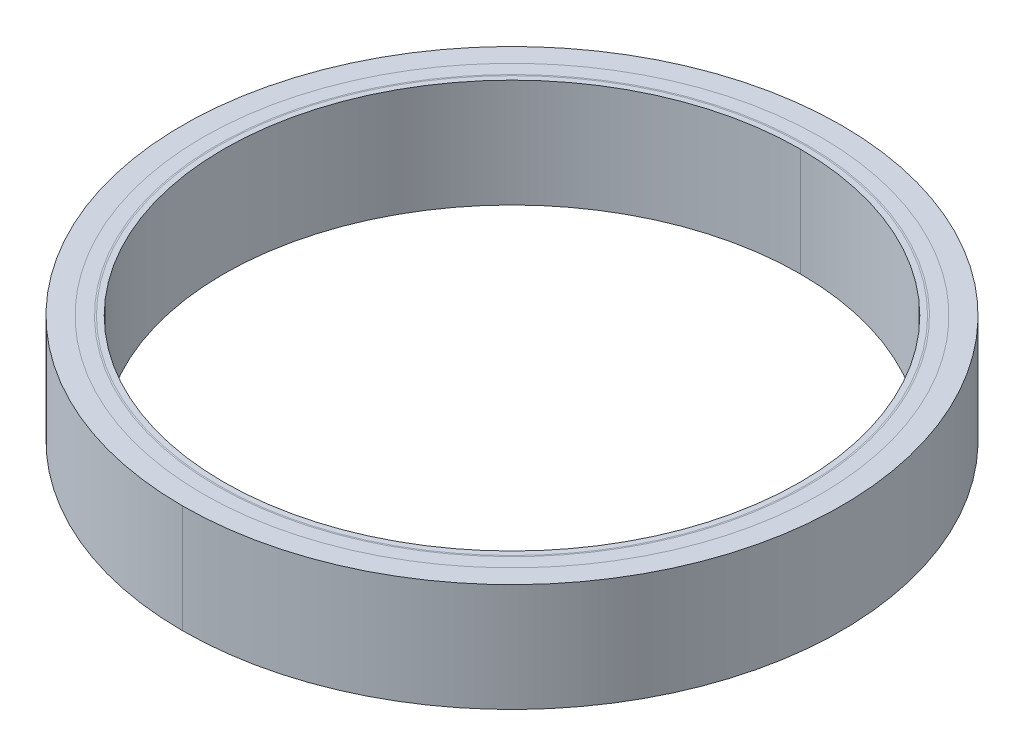
ISO-10303-21;
HEADER;
FILE_DESCRIPTION(('STEP AP214'),'2;1');
FILE_NAME('part.step','',(''),(''),'','','');
FILE_SCHEMA(('AUTOMOTIVE_DESIGN { 1 0 10303 214 1 1 1 1 }'));
ENDSEC;
DATA;
#1=APPLICATION_CONTEXT('core data for automotive mechanical design processes');
#2=APPLICATION_PROTOCOL_DEFINITION('international standard','automotive_design',2000,#1);
#3=PRODUCT_CONTEXT('',#1,'mechanical');
#4=PRODUCT('Part','Part','',(#3));
#5=PRODUCT_RELATED_PRODUCT_CATEGORY('part','',(#4));
#6=PRODUCT_DEFINITION_FORMATION('','',#4);
#7=PRODUCT_DEFINITION_CONTEXT('part definition',#1,'design');
#8=PRODUCT_DEFINITION('design','',#6,#7);
#9=PRODUCT_DEFINITION_SHAPE('','',#8);
#10=(LENGTH_UNIT() NAMED_UNIT(*) SI_UNIT(.MILLI.,.METRE.));
#11=(NAMED_UNIT(*) PLANE_ANGLE_UNIT() SI_UNIT($,.RADIAN.));
#12=(NAMED_UNIT(*) SI_UNIT($,.STERADIAN.) SOLID_ANGLE_UNIT());
#13=UNCERTAINTY_MEASURE_WITH_UNIT(LENGTH_MEASURE(1.E-05),#10,'distance_accuracy_value','');
#14=(GEOMETRIC_REPRESENTATION_CONTEXT(3) GLOBAL_UNCERTAINTY_ASSIGNED_CONTEXT((#13)) GLOBAL_UNIT_ASSIGNED_CONTEXT((#10,
#11,#12)) REPRESENTATION_CONTEXT('',''));
#15=CARTESIAN_POINT('',(0.,0.,0.));
#16=DIRECTION('',(0.,0.,1.));
#17=DIRECTION('',(1.,0.,0.));
#18=AXIS2_PLACEMENT_3D('',#15,#16,#17);
#19=CARTESIAN_POINT('',(0.,914.4,0.));
#20=DIRECTION('',(0.,1.,0.));
#21=DIRECTION('',(0.,0.,-1.));
#22=AXIS2_PLACEMENT_3D('',#19,#20,#21);
#23=CYLINDRICAL_SURFACE('',#22,133.35);
#24=DIRECTION('',(0.,1.,0.));
#25=VECTOR('',#24,1.);
#26=CARTESIAN_POINT('',(0.,914.4,-133.35));
#27=LINE('',#26,#25);
#28=CARTESIAN_POINT('',(0.,914.4,-133.35));
#29=VERTEX_POINT('',#28);
#30=CARTESIAN_POINT('',(0.,964.4,-133.35));
#31=VERTEX_POINT('',#30);
#32=EDGE_CURVE('E112',#29,#31,#27,.T.);
#33=ORIENTED_EDGE('',*,*,#32,.T.);
#34=CARTESIAN_POINT('',(0.,964.4,0.));
#35=DIRECTION('',(0.,-1.,0.));
#36=DIRECTION('',(0.,0.,-1.));
#37=AXIS2_PLACEMENT_3D('',#34,#35,#36);
#38=CIRCLE('',#37,133.35);
#39=CARTESIAN_POINT('',(0.,964.4,133.35));
#40=VERTEX_POINT('',#39);
#41=EDGE_CURVE('E87',#31,#40,#38,.F.);
#42=ORIENTED_EDGE('',*,*,#41,.T.);
#43=DIRECTION('',(0.,-1.,0.));
#44=VECTOR('',#43,1.);
#45=CARTESIAN_POINT('',(0.,914.4,133.35));
#46=LINE('',#45,#44);
#47=CARTESIAN_POINT('',(0.,914.4,133.35));
#48=VERTEX_POINT('',#47);
#49=EDGE_CURVE('E110',#40,#48,#46,.T.);
#50=ORIENTED_EDGE('',*,*,#49,.T.);
#51=CARTESIAN_POINT('',(0.,914.4,0.));
#52=DIRECTION('',(0.,-1.,0.));
#53=DIRECTION('',(0.,0.,-1.));
#54=AXIS2_PLACEMENT_3D('',#51,#52,#53);
#55=CIRCLE('',#54,133.35);
#56=EDGE_CURVE('E133',#29,#48,#55,.F.);
#57=ORIENTED_EDGE('',*,*,#56,.F.);
#58=EDGE_LOOP('',(#33,#42,#50,#57));
#59=FACE_BOUND('',#58,.T.);
#60=ADVANCED_FACE('F67',(#59),#23,.F.);
#61=CARTESIAN_POINT('',(0.,914.4,0.));
#62=DIRECTION('',(0.,1.,0.));
#63=DIRECTION('',(0.,0.,-1.));
#64=AXIS2_PLACEMENT_3D('',#61,#62,#63);
#65=CYLINDRICAL_SURFACE('',#64,135.89);
#66=CARTESIAN_POINT('',(0.,964.4,0.));
#67=DIRECTION('',(0.,-1.,0.));
#68=DIRECTION('',(0.,0.,-1.));
#69=AXIS2_PLACEMENT_3D('',#66,#67,#68);
#70=CIRCLE('',#69,135.89);
#71=CARTESIAN_POINT('',(0.,964.4,-135.89));
#72=VERTEX_POINT('',#71);
#73=CARTESIAN_POINT('',(0.,964.4,135.89));
#74=VERTEX_POINT('',#73);
#75=EDGE_CURVE('E80',#72,#74,#70,.F.);
#76=ORIENTED_EDGE('',*,*,#75,.F.);
#77=DIRECTION('',(0.,-1.,0.));
#78=VECTOR('',#77,1.);
#79=CARTESIAN_POINT('',(0.,914.4,-135.89));
#80=LINE('',#79,#78);
#81=CARTESIAN_POINT('',(0.,914.4,-135.89));
#82=VERTEX_POINT('',#81);
#83=EDGE_CURVE('E118',#72,#82,#80,.T.);
#84=ORIENTED_EDGE('',*,*,#83,.T.);
#85=CARTESIAN_POINT('',(0.,914.4,0.));
#86=DIRECTION('',(0.,-1.,0.));
#87=DIRECTION('',(0.,0.,-1.));
#88=AXIS2_PLACEMENT_3D('',#85,#86,#87);
#89=CIRCLE('',#88,135.89);
#90=CARTESIAN_POINT('',(0.,914.4,135.89));
#91=VERTEX_POINT('',#90);
#92=EDGE_CURVE('E126',#82,#91,#89,.F.);
#93=ORIENTED_EDGE('',*,*,#92,.T.);
#94=DIRECTION('',(0.,1.,0.));
#95=VECTOR('',#94,1.);
#96=CARTESIAN_POINT('',(0.,914.4,135.89));
#97=LINE('',#96,#95);
#98=EDGE_CURVE('E123',#91,#74,#97,.T.);
#99=ORIENTED_EDGE('',*,*,#98,.T.);
#100=EDGE_LOOP('',(#76,#84,#93,#99));
#101=FACE_BOUND('',#100,.T.);
#102=ADVANCED_FACE('F145',(#101),#65,.T.);
#103=CARTESIAN_POINT('',(0.,914.4,0.));
#104=DIRECTION('',(0.,1.,0.));
#105=DIRECTION('',(0.,0.,-1.));
#106=AXIS2_PLACEMENT_3D('',#103,#104,#105);
#107=CYLINDRICAL_SURFACE('',#106,135.89);
#108=CARTESIAN_POINT('',(0.,964.4,0.));
#109=DIRECTION('',(0.,-1.,0.));
#110=DIRECTION('',(0.,0.,-1.));
#111=AXIS2_PLACEMENT_3D('',#108,#109,#110);
#112=CIRCLE('',#111,135.89);
#113=EDGE_CURVE('E113',#74,#72,#112,.F.);
#114=ORIENTED_EDGE('',*,*,#113,.F.);
#115=ORIENTED_EDGE('',*,*,#98,.F.);
#116=CARTESIAN_POINT('',(0.,914.4,0.));
#117=DIRECTION('',(0.,-1.,0.));
#118=DIRECTION('',(0.,0.,-1.));
#119=AXIS2_PLACEMENT_3D('',#116,#117,#118);
#120=CIRCLE('',#119,135.89);
#121=EDGE_CURVE('E134',#91,#82,#120,.F.);
#122=ORIENTED_EDGE('',*,*,#121,.T.);
#123=ORIENTED_EDGE('',*,*,#83,.F.);
#124=EDGE_LOOP('',(#114,#115,#122,#123));
#125=FACE_BOUND('',#124,.T.);
#126=ADVANCED_FACE('F149',(#125),#107,.T.);
#127=CARTESIAN_POINT('',(0.,914.4,0.));
#128=DIRECTION('',(0.,1.,0.));
#129=DIRECTION('',(0.,0.,-1.));
#130=AXIS2_PLACEMENT_3D('',#127,#128,#129);
#131=CYLINDRICAL_SURFACE('',#130,133.35);
#132=ORIENTED_EDGE('',*,*,#49,.F.);
#133=CARTESIAN_POINT('',(0.,964.4,0.));
#134=DIRECTION('',(0.,-1.,0.));
#135=DIRECTION('',(0.,0.,-1.));
#136=AXIS2_PLACEMENT_3D('',#133,#134,#135);
#137=CIRCLE('',#136,133.35);
#138=EDGE_CURVE('E12',#40,#31,#137,.F.);
#139=ORIENTED_EDGE('',*,*,#138,.T.);
#140=ORIENTED_EDGE('',*,*,#32,.F.);
#141=CARTESIAN_POINT('',(0.,914.4,0.));
#142=DIRECTION('',(0.,-1.,0.));
#143=DIRECTION('',(0.,0.,-1.));
#144=AXIS2_PLACEMENT_3D('',#141,#142,#143);
#145=CIRCLE('',#144,133.35);
#146=EDGE_CURVE('E74',#48,#29,#145,.F.);
#147=ORIENTED_EDGE('',*,*,#146,.F.);
#148=EDGE_LOOP('',(#132,#139,#140,#147));
#149=FACE_BOUND('',#148,.T.);
#150=ADVANCED_FACE('F116',(#149),#131,.F.);
#151=CARTESIAN_POINT('',(0.,914.4,0.));
#152=DIRECTION('',(0.,-1.,0.));
#153=DIRECTION('',(0.,0.,-1.));
#154=AXIS2_PLACEMENT_3D('',#151,#152,#153);
#155=PLANE('',#154);
#156=ORIENTED_EDGE('',*,*,#121,.F.);
#157=ORIENTED_EDGE('',*,*,#92,.F.);
#158=EDGE_LOOP('',(#156,#157));
#159=FACE_BOUND('',#158,.T.);
#160=ORIENTED_EDGE('',*,*,#56,.T.);
#161=ORIENTED_EDGE('',*,*,#146,.T.);
#162=EDGE_LOOP('',(#160,#161));
#163=FACE_BOUND('',#162,.T.);
#164=ADVANCED_FACE('F132',(#159,#163),#155,.T.);
#165=CARTESIAN_POINT('',(0.,964.4,0.));
#166=DIRECTION('',(0.,-1.,0.));
#167=DIRECTION('',(0.,0.,-1.));
#168=AXIS2_PLACEMENT_3D('',#165,#166,#167);
#169=PLANE('',#168);
#170=ORIENTED_EDGE('',*,*,#75,.T.);
#171=ORIENTED_EDGE('',*,*,#113,.T.);
#172=EDGE_LOOP('',(#170,#171));
#173=FACE_BOUND('',#172,.T.);
#174=ORIENTED_EDGE('',*,*,#138,.F.);
#175=ORIENTED_EDGE('',*,*,#41,.F.);
#176=EDGE_LOOP('',(#174,#175));
#177=FACE_BOUND('',#176,.T.);
#178=ADVANCED_FACE('F103',(#173,#177),#169,.F.);
#179=CLOSED_SHELL('',(#60,#102,#126,#150,#164,#178));
#180=MANIFOLD_SOLID_BREP('B2',#179);
#181=CARTESIAN_POINT('',(0.,914.4,0.));
#182=DIRECTION('',(0.,1.,0.));
#183=DIRECTION('',(0.,0.,-1.));
#184=AXIS2_PLACEMENT_3D('',#181,#182,#183);
#185=CYLINDRICAL_SURFACE('',#184,135.89);
#186=DIRECTION('',(0.,1.,0.));
#187=VECTOR('',#186,1.);
#188=CARTESIAN_POINT('',(0.,914.4,-135.89));
#189=LINE('',#188,#187);
#190=CARTESIAN_POINT('',(0.,914.4,-135.89));
#191=VERTEX_POINT('',#190);
#192=CARTESIAN_POINT('',(0.,964.4,-135.89));
#193=VERTEX_POINT('',#192);
#194=EDGE_CURVE('E287',#191,#193,#189,.T.);
#195=ORIENTED_EDGE('',*,*,#194,.T.);
#196=CARTESIAN_POINT('',(0.,964.4,0.));
#197=DIRECTION('',(0.,-1.,0.));
#198=DIRECTION('',(0.,0.,-1.));
#199=AXIS2_PLACEMENT_3D('',#196,#197,#198);
#200=CIRCLE('',#199,135.89);
#201=CARTESIAN_POINT('',(0.,964.4,135.89));
#202=VERTEX_POINT('',#201);
#203=EDGE_CURVE('E262',#193,#202,#200,.F.);
#204=ORIENTED_EDGE('',*,*,#203,.T.);
#205=DIRECTION('',(0.,-1.,0.));
#206=VECTOR('',#205,1.);
#207=CARTESIAN_POINT('',(0.,914.4,135.89));
#208=LINE('',#207,#206);
#209=CARTESIAN_POINT('',(0.,914.4,135.89));
#210=VERTEX_POINT('',#209);
#211=EDGE_CURVE('E285',#202,#210,#208,.T.);
#212=ORIENTED_EDGE('',*,*,#211,.T.);
#213=CARTESIAN_POINT('',(0.,914.4,0.));
#214=DIRECTION('',(0.,-1.,0.));
#215=DIRECTION('',(0.,0.,-1.));
#216=AXIS2_PLACEMENT_3D('',#213,#214,#215);
#217=CIRCLE('',#216,135.89);
#218=EDGE_CURVE('E309',#191,#210,#217,.F.);
#219=ORIENTED_EDGE('',*,*,#218,.F.);
#220=EDGE_LOOP('',(#195,#204,#212,#219));
#221=FACE_BOUND('',#220,.T.);
#222=ADVANCED_FACE('F242',(#221),#185,.F.);
#223=CARTESIAN_POINT('',(0.,914.4,0.));
#224=DIRECTION('',(0.,1.,0.));
#225=DIRECTION('',(0.,0.,-1.));
#226=AXIS2_PLACEMENT_3D('',#223,#224,#225);
#227=CYLINDRICAL_SURFACE('',#226,136.525);
#228=CARTESIAN_POINT('',(0.,964.4,0.));
#229=DIRECTION('',(0.,-1.,0.));
#230=DIRECTION('',(0.,0.,-1.));
#231=AXIS2_PLACEMENT_3D('',#228,#229,#230);
#232=CIRCLE('',#231,136.525);
#233=CARTESIAN_POINT('',(0.,964.4,-136.525));
#234=VERTEX_POINT('',#233);
#235=CARTESIAN_POINT('',(0.,964.4,136.525));
#236=VERTEX_POINT('',#235);
#237=EDGE_CURVE('E255',#234,#236,#232,.F.);
#238=ORIENTED_EDGE('',*,*,#237,.F.);
#239=DIRECTION('',(0.,-1.,0.));
#240=VECTOR('',#239,1.);
#241=CARTESIAN_POINT('',(0.,914.4,-136.525));
#242=LINE('',#241,#240);
#243=CARTESIAN_POINT('',(0.,914.4,-136.525));
#244=VERTEX_POINT('',#243);
#245=EDGE_CURVE('E293',#234,#244,#242,.T.);
#246=ORIENTED_EDGE('',*,*,#245,.T.);
#247=CARTESIAN_POINT('',(0.,914.4,0.));
#248=DIRECTION('',(0.,-1.,0.));
#249=DIRECTION('',(0.,0.,-1.));
#250=AXIS2_PLACEMENT_3D('',#247,#248,#249);
#251=CIRCLE('',#250,136.525);
#252=CARTESIAN_POINT('',(0.,914.4,136.525));
#253=VERTEX_POINT('',#252);
#254=EDGE_CURVE('E301',#244,#253,#251,.F.);
#255=ORIENTED_EDGE('',*,*,#254,.T.);
#256=DIRECTION('',(0.,1.,0.));
#257=VECTOR('',#256,1.);
#258=CARTESIAN_POINT('',(0.,914.4,136.525));
#259=LINE('',#258,#257);
#260=EDGE_CURVE('E298',#253,#236,#259,.T.);
#261=ORIENTED_EDGE('',*,*,#260,.T.);
#262=EDGE_LOOP('',(#238,#246,#255,#261));
#263=FACE_BOUND('',#262,.T.);
#264=ADVANCED_FACE('F320',(#263),#227,.T.);
#265=CARTESIAN_POINT('',(0.,914.4,0.));
#266=DIRECTION('',(0.,1.,0.));
#267=DIRECTION('',(0.,0.,-1.));
#268=AXIS2_PLACEMENT_3D('',#265,#266,#267);
#269=CYLINDRICAL_SURFACE('',#268,136.525);
#270=CARTESIAN_POINT('',(0.,964.4,0.));
#271=DIRECTION('',(0.,-1.,0.));
#272=DIRECTION('',(0.,0.,-1.));
#273=AXIS2_PLACEMENT_3D('',#270,#271,#272);
#274=CIRCLE('',#273,136.525);
#275=EDGE_CURVE('E288',#236,#234,#274,.F.);
#276=ORIENTED_EDGE('',*,*,#275,.F.);
#277=ORIENTED_EDGE('',*,*,#260,.F.);
#278=CARTESIAN_POINT('',(0.,914.4,0.));
#279=DIRECTION('',(0.,-1.,0.));
#280=DIRECTION('',(0.,0.,-1.));
#281=AXIS2_PLACEMENT_3D('',#278,#279,#280);
#282=CIRCLE('',#281,136.525);
#283=EDGE_CURVE('E310',#253,#244,#282,.F.);
#284=ORIENTED_EDGE('',*,*,#283,.T.);
#285=ORIENTED_EDGE('',*,*,#245,.F.);
#286=EDGE_LOOP('',(#276,#277,#284,#285));
#287=FACE_BOUND('',#286,.T.);
#288=ADVANCED_FACE('F324',(#287),#269,.T.);
#289=CARTESIAN_POINT('',(0.,914.4,0.));
#290=DIRECTION('',(0.,1.,0.));
#291=DIRECTION('',(0.,0.,-1.));
#292=AXIS2_PLACEMENT_3D('',#289,#290,#291);
#293=CYLINDRICAL_SURFACE('',#292,135.89);
#294=ORIENTED_EDGE('',*,*,#211,.F.);
#295=CARTESIAN_POINT('',(0.,964.4,0.));
#296=DIRECTION('',(0.,-1.,0.));
#297=DIRECTION('',(0.,0.,-1.));
#298=AXIS2_PLACEMENT_3D('',#295,#296,#297);
#299=CIRCLE('',#298,135.89);
#300=EDGE_CURVE('E65',#202,#193,#299,.F.);
#301=ORIENTED_EDGE('',*,*,#300,.T.);
#302=ORIENTED_EDGE('',*,*,#194,.F.);
#303=CARTESIAN_POINT('',(0.,914.4,0.));
#304=DIRECTION('',(0.,-1.,0.));
#305=DIRECTION('',(0.,0.,-1.));
#306=AXIS2_PLACEMENT_3D('',#303,#304,#305);
#307=CIRCLE('',#306,135.89);
#308=EDGE_CURVE('E249',#210,#191,#307,.F.);
#309=ORIENTED_EDGE('',*,*,#308,.F.);
#310=EDGE_LOOP('',(#294,#301,#302,#309));
#311=FACE_BOUND('',#310,.T.);
#312=ADVANCED_FACE('F291',(#311),#293,.F.);
#313=CARTESIAN_POINT('',(0.,914.4,0.));
#314=DIRECTION('',(0.,-1.,0.));
#315=DIRECTION('',(0.,0.,-1.));
#316=AXIS2_PLACEMENT_3D('',#313,#314,#315);
#317=PLANE('',#316);
#318=ORIENTED_EDGE('',*,*,#283,.F.);
#319=ORIENTED_EDGE('',*,*,#254,.F.);
#320=EDGE_LOOP('',(#318,#319));
#321=FACE_BOUND('',#320,.T.);
#322=ORIENTED_EDGE('',*,*,#218,.T.);
#323=ORIENTED_EDGE('',*,*,#308,.T.);
#324=EDGE_LOOP('',(#322,#323));
#325=FACE_BOUND('',#324,.T.);
#326=ADVANCED_FACE('F308',(#321,#325),#317,.T.);
#327=CARTESIAN_POINT('',(0.,964.4,0.));
#328=DIRECTION('',(0.,-1.,0.));
#329=DIRECTION('',(0.,0.,-1.));
#330=AXIS2_PLACEMENT_3D('',#327,#328,#329);
#331=PLANE('',#330);
#332=ORIENTED_EDGE('',*,*,#237,.T.);
#333=ORIENTED_EDGE('',*,*,#275,.T.);
#334=EDGE_LOOP('',(#332,#333));
#335=FACE_BOUND('',#334,.T.);
#336=ORIENTED_EDGE('',*,*,#300,.F.);
#337=ORIENTED_EDGE('',*,*,#203,.F.);
#338=EDGE_LOOP('',(#336,#337));
#339=FACE_BOUND('',#338,.T.);
#340=ADVANCED_FACE('F278',(#335,#339),#331,.F.);
#341=CLOSED_SHELL('',(#222,#264,#288,#312,#326,#340));
#342=MANIFOLD_SOLID_BREP('B6',#341);
#343=CARTESIAN_POINT('',(0.,914.4,0.));
#344=DIRECTION('',(0.,1.,0.));
#345=DIRECTION('',(0.,0.,-1.));
#346=AXIS2_PLACEMENT_3D('',#343,#344,#345);
#347=CYLINDRICAL_SURFACE('',#346,136.525);
#348=DIRECTION('',(0.,1.,0.));
#349=VECTOR('',#348,1.);
#350=CARTESIAN_POINT('',(0.,914.4,-136.525));
#351=LINE('',#350,#349);
#352=CARTESIAN_POINT('',(0.,914.4,-136.525));
#353=VERTEX_POINT('',#352);
#354=CARTESIAN_POINT('',(0.,964.4,-136.525));
#355=VERTEX_POINT('',#354);
#356=EDGE_CURVE('E461',#353,#355,#351,.T.);
#357=ORIENTED_EDGE('',*,*,#356,.T.);
#358=CARTESIAN_POINT('',(0.,964.4,0.));
#359=DIRECTION('',(0.,-1.,0.));
#360=DIRECTION('',(0.,0.,-1.));
#361=AXIS2_PLACEMENT_3D('',#358,#359,#360);
#362=CIRCLE('',#361,136.525);
#363=CARTESIAN_POINT('',(0.,964.4,136.525));
#364=VERTEX_POINT('',#363);
#365=EDGE_CURVE('E436',#355,#364,#362,.F.);
#366=ORIENTED_EDGE('',*,*,#365,.T.);
#367=DIRECTION('',(0.,-1.,0.));
#368=VECTOR('',#367,1.);
#369=CARTESIAN_POINT('',(0.,914.4,136.525));
#370=LINE('',#369,#368);
#371=CARTESIAN_POINT('',(0.,914.4,136.525));
#372=VERTEX_POINT('',#371);
#373=EDGE_CURVE('E459',#364,#372,#370,.T.);
#374=ORIENTED_EDGE('',*,*,#373,.T.);
#375=CARTESIAN_POINT('',(0.,914.4,0.));
#376=DIRECTION('',(0.,-1.,0.));
#377=DIRECTION('',(0.,0.,-1.));
#378=AXIS2_PLACEMENT_3D('',#375,#376,#377);
#379=CIRCLE('',#378,136.525);
#380=EDGE_CURVE('E483',#353,#372,#379,.F.);
#381=ORIENTED_EDGE('',*,*,#380,.F.);
#382=EDGE_LOOP('',(#357,#366,#374,#381));
#383=FACE_BOUND('',#382,.T.);
#384=ADVANCED_FACE('F416',(#383),#347,.F.);
#385=CARTESIAN_POINT('',(0.,914.4,0.));
#386=DIRECTION('',(0.,1.,0.));
#387=DIRECTION('',(0.,0.,-1.));
#388=AXIS2_PLACEMENT_3D('',#385,#386,#387);
#389=CYLINDRICAL_SURFACE('',#388,142.875);
#390=CARTESIAN_POINT('',(0.,964.4,0.));
#391=DIRECTION('',(0.,-1.,0.));
#392=DIRECTION('',(0.,0.,-1.));
#393=AXIS2_PLACEMENT_3D('',#390,#391,#392);
#394=CIRCLE('',#393,142.875);
#395=CARTESIAN_POINT('',(0.,964.4,-142.875));
#396=VERTEX_POINT('',#395);
#397=CARTESIAN_POINT('',(0.,964.4,142.875));
#398=VERTEX_POINT('',#397);
#399=EDGE_CURVE('E429',#396,#398,#394,.F.);
#400=ORIENTED_EDGE('',*,*,#399,.F.);
#401=DIRECTION('',(0.,-1.,0.));
#402=VECTOR('',#401,1.);
#403=CARTESIAN_POINT('',(0.,914.4,-142.875));
#404=LINE('',#403,#402);
#405=CARTESIAN_POINT('',(0.,914.4,-142.875));
#406=VERTEX_POINT('',#405);
#407=EDGE_CURVE('E467',#396,#406,#404,.T.);
#408=ORIENTED_EDGE('',*,*,#407,.T.);
#409=CARTESIAN_POINT('',(0.,914.4,0.));
#410=DIRECTION('',(0.,-1.,0.));
#411=DIRECTION('',(0.,0.,-1.));
#412=AXIS2_PLACEMENT_3D('',#409,#410,#411);
#413=CIRCLE('',#412,142.875);
#414=CARTESIAN_POINT('',(0.,914.4,142.875));
#415=VERTEX_POINT('',#414);
#416=EDGE_CURVE('E475',#406,#415,#413,.F.);
#417=ORIENTED_EDGE('',*,*,#416,.T.);
#418=DIRECTION('',(0.,1.,0.));
#419=VECTOR('',#418,1.);
#420=CARTESIAN_POINT('',(0.,914.4,142.875));
#421=LINE('',#420,#419);
#422=EDGE_CURVE('E472',#415,#398,#421,.T.);
#423=ORIENTED_EDGE('',*,*,#422,.T.);
#424=EDGE_LOOP('',(#400,#408,#417,#423));
#425=FACE_BOUND('',#424,.T.);
#426=ADVANCED_FACE('F494',(#425),#389,.T.);
#427=CARTESIAN_POINT('',(0.,914.4,0.));
#428=DIRECTION('',(0.,1.,0.));
#429=DIRECTION('',(0.,0.,-1.));
#430=AXIS2_PLACEMENT_3D('',#427,#428,#429);
#431=CYLINDRICAL_SURFACE('',#430,142.875);
#432=CARTESIAN_POINT('',(0.,964.4,0.));
#433=DIRECTION('',(0.,-1.,0.));
#434=DIRECTION('',(0.,0.,-1.));
#435=AXIS2_PLACEMENT_3D('',#432,#433,#434);
#436=CIRCLE('',#435,142.875);
#437=EDGE_CURVE('E462',#398,#396,#436,.F.);
#438=ORIENTED_EDGE('',*,*,#437,.F.);
#439=ORIENTED_EDGE('',*,*,#422,.F.);
#440=CARTESIAN_POINT('',(0.,914.4,0.));
#441=DIRECTION('',(0.,-1.,0.));
#442=DIRECTION('',(0.,0.,-1.));
#443=AXIS2_PLACEMENT_3D('',#440,#441,#442);
#444=CIRCLE('',#443,142.875);
#445=EDGE_CURVE('E484',#415,#406,#444,.F.);
#446=ORIENTED_EDGE('',*,*,#445,.T.);
#447=ORIENTED_EDGE('',*,*,#407,.F.);
#448=EDGE_LOOP('',(#438,#439,#446,#447));
#449=FACE_BOUND('',#448,.T.);
#450=ADVANCED_FACE('F498',(#449),#431,.T.);
#451=CARTESIAN_POINT('',(0.,914.4,0.));
#452=DIRECTION('',(0.,1.,0.));
#453=DIRECTION('',(0.,0.,-1.));
#454=AXIS2_PLACEMENT_3D('',#451,#452,#453);
#455=CYLINDRICAL_SURFACE('',#454,136.525);
#456=ORIENTED_EDGE('',*,*,#373,.F.);
#457=CARTESIAN_POINT('',(0.,964.4,0.));
#458=DIRECTION('',(0.,-1.,0.));
#459=DIRECTION('',(0.,0.,-1.));
#460=AXIS2_PLACEMENT_3D('',#457,#458,#459);
#461=CIRCLE('',#460,136.525);
#462=EDGE_CURVE('E240',#364,#355,#461,.F.);
#463=ORIENTED_EDGE('',*,*,#462,.T.);
#464=ORIENTED_EDGE('',*,*,#356,.F.);
#465=CARTESIAN_POINT('',(0.,914.4,0.));
#466=DIRECTION('',(0.,-1.,0.));
#467=DIRECTION('',(0.,0.,-1.));
#468=AXIS2_PLACEMENT_3D('',#465,#466,#467);
#469=CIRCLE('',#468,136.525);
#470=EDGE_CURVE('E423',#372,#353,#469,.F.);
#471=ORIENTED_EDGE('',*,*,#470,.F.);
#472=EDGE_LOOP('',(#456,#463,#464,#471));
#473=FACE_BOUND('',#472,.T.);
#474=ADVANCED_FACE('F465',(#473),#455,.F.);
#475=CARTESIAN_POINT('',(0.,914.4,0.));
#476=DIRECTION('',(0.,-1.,0.));
#477=DIRECTION('',(0.,0.,-1.));
#478=AXIS2_PLACEMENT_3D('',#475,#476,#477);
#479=PLANE('',#478);
#480=ORIENTED_EDGE('',*,*,#445,.F.);
#481=ORIENTED_EDGE('',*,*,#416,.F.);
#482=EDGE_LOOP('',(#480,#481));
#483=FACE_BOUND('',#482,.T.);
#484=ORIENTED_EDGE('',*,*,#380,.T.);
#485=ORIENTED_EDGE('',*,*,#470,.T.);
#486=EDGE_LOOP('',(#484,#485));
#487=FACE_BOUND('',#486,.T.);
#488=ADVANCED_FACE('F482',(#483,#487),#479,.T.);
#489=CARTESIAN_POINT('',(0.,964.4,0.));
#490=DIRECTION('',(0.,-1.,0.));
#491=DIRECTION('',(0.,0.,-1.));
#492=AXIS2_PLACEMENT_3D('',#489,#490,#491);
#493=PLANE('',#492);
#494=ORIENTED_EDGE('',*,*,#399,.T.);
#495=ORIENTED_EDGE('',*,*,#437,.T.);
#496=EDGE_LOOP('',(#494,#495));
#497=FACE_BOUND('',#496,.T.);
#498=ORIENTED_EDGE('',*,*,#462,.F.);
#499=ORIENTED_EDGE('',*,*,#365,.F.);
#500=EDGE_LOOP('',(#498,#499));
#501=FACE_BOUND('',#500,.T.);
#502=ADVANCED_FACE('F452',(#497,#501),#493,.F.);
#503=CLOSED_SHELL('',(#384,#426,#450,#474,#488,#502));
#504=MANIFOLD_SOLID_BREP('B59',#503);
#505=CARTESIAN_POINT('',(0.,914.4,0.));
#506=DIRECTION('',(0.,1.,0.));
#507=DIRECTION('',(0.,0.,-1.));
#508=AXIS2_PLACEMENT_3D('',#505,#506,#507);
#509=CYLINDRICAL_SURFACE('',#508,142.875);
#510=DIRECTION('',(0.,1.,0.));
#511=VECTOR('',#510,1.);
#512=CARTESIAN_POINT('',(0.,914.4,-142.875));
#513=LINE('',#512,#511);
#514=CARTESIAN_POINT('',(0.,914.4,-142.875));
#515=VERTEX_POINT('',#514);
#516=CARTESIAN_POINT('',(0.,964.4,-142.875));
#517=VERTEX_POINT('',#516);
#518=EDGE_CURVE('E626',#515,#517,#513,.T.);
#519=ORIENTED_EDGE('',*,*,#518,.T.);
#520=CARTESIAN_POINT('',(0.,964.4,0.));
#521=DIRECTION('',(0.,-1.,0.));
#522=DIRECTION('',(0.,0.,-1.));
#523=AXIS2_PLACEMENT_3D('',#520,#521,#522);
#524=CIRCLE('',#523,142.875);
#525=CARTESIAN_POINT('',(0.,964.4,142.875));
#526=VERTEX_POINT('',#525);
#527=EDGE_CURVE('E601',#517,#526,#524,.F.);
#528=ORIENTED_EDGE('',*,*,#527,.T.);
#529=DIRECTION('',(0.,-1.,0.));
#530=VECTOR('',#529,1.);
#531=CARTESIAN_POINT('',(0.,914.4,142.875));
#532=LINE('',#531,#530);
#533=CARTESIAN_POINT('',(0.,914.4,142.875));
#534=VERTEX_POINT('',#533);
#535=EDGE_CURVE('E624',#526,#534,#532,.T.);
#536=ORIENTED_EDGE('',*,*,#535,.T.);
#537=CARTESIAN_POINT('',(0.,914.4,0.));
#538=DIRECTION('',(0.,-1.,0.));
#539=DIRECTION('',(0.,0.,-1.));
#540=AXIS2_PLACEMENT_3D('',#537,#538,#539);
#541=CIRCLE('',#540,142.875);
#542=EDGE_CURVE('E648',#515,#534,#541,.F.);
#543=ORIENTED_EDGE('',*,*,#542,.F.);
#544=EDGE_LOOP('',(#519,#528,#536,#543));
#545=FACE_BOUND('',#544,.T.);
#546=ADVANCED_FACE('F581',(#545),#509,.F.);
#547=CARTESIAN_POINT('',(0.,914.4,0.));
#548=DIRECTION('',(0.,1.,0.));
#549=DIRECTION('',(0.,0.,-1.));
#550=AXIS2_PLACEMENT_3D('',#547,#548,#549);
#551=CYLINDRICAL_SURFACE('',#550,152.4);
#552=CARTESIAN_POINT('',(0.,964.4,0.));
#553=DIRECTION('',(0.,-1.,0.));
#554=DIRECTION('',(0.,0.,-1.));
#555=AXIS2_PLACEMENT_3D('',#552,#553,#554);
#556=CIRCLE('',#555,152.4);
#557=CARTESIAN_POINT('',(0.,964.4,-152.4));
#558=VERTEX_POINT('',#557);
#559=CARTESIAN_POINT('',(0.,964.4,152.4));
#560=VERTEX_POINT('',#559);
#561=EDGE_CURVE('E594',#558,#560,#556,.F.);
#562=ORIENTED_EDGE('',*,*,#561,.F.);
#563=DIRECTION('',(0.,-1.,0.));
#564=VECTOR('',#563,1.);
#565=CARTESIAN_POINT('',(0.,914.4,-152.4));
#566=LINE('',#565,#564);
#567=CARTESIAN_POINT('',(0.,914.4,-152.4));
#568=VERTEX_POINT('',#567);
#569=EDGE_CURVE('E632',#558,#568,#566,.T.);
#570=ORIENTED_EDGE('',*,*,#569,.T.);
#571=CARTESIAN_POINT('',(0.,914.4,0.));
#572=DIRECTION('',(0.,-1.,0.));
#573=DIRECTION('',(0.,0.,-1.));
#574=AXIS2_PLACEMENT_3D('',#571,#572,#573);
#575=CIRCLE('',#574,152.4);
#576=CARTESIAN_POINT('',(0.,914.4,152.4));
#577=VERTEX_POINT('',#576);
#578=EDGE_CURVE('E640',#568,#577,#575,.F.);
#579=ORIENTED_EDGE('',*,*,#578,.T.);
#580=DIRECTION('',(0.,1.,0.));
#581=VECTOR('',#580,1.);
#582=CARTESIAN_POINT('',(0.,914.4,152.4));
#583=LINE('',#582,#581);
#584=EDGE_CURVE('E637',#577,#560,#583,.T.);
#585=ORIENTED_EDGE('',*,*,#584,.T.);
#586=EDGE_LOOP('',(#562,#570,#579,#585));
#587=FACE_BOUND('',#586,.T.);
#588=ADVANCED_FACE('F659',(#587),#551,.T.);
#589=CARTESIAN_POINT('',(0.,914.4,0.));
#590=DIRECTION('',(0.,1.,0.));
#591=DIRECTION('',(0.,0.,-1.));
#592=AXIS2_PLACEMENT_3D('',#589,#590,#591);
#593=CYLINDRICAL_SURFACE('',#592,152.4);
#594=CARTESIAN_POINT('',(0.,964.4,0.));
#595=DIRECTION('',(0.,-1.,0.));
#596=DIRECTION('',(0.,0.,-1.));
#597=AXIS2_PLACEMENT_3D('',#594,#595,#596);
#598=CIRCLE('',#597,152.4);
#599=EDGE_CURVE('E627',#560,#558,#598,.F.);
#600=ORIENTED_EDGE('',*,*,#599,.F.);
#601=ORIENTED_EDGE('',*,*,#584,.F.);
#602=CARTESIAN_POINT('',(0.,914.4,0.));
#603=DIRECTION('',(0.,-1.,0.));
#604=DIRECTION('',(0.,0.,-1.));
#605=AXIS2_PLACEMENT_3D('',#602,#603,#604);
#606=CIRCLE('',#605,152.4);
#607=EDGE_CURVE('E649',#577,#568,#606,.F.);
#608=ORIENTED_EDGE('',*,*,#607,.T.);
#609=ORIENTED_EDGE('',*,*,#569,.F.);
#610=EDGE_LOOP('',(#600,#601,#608,#609));
#611=FACE_BOUND('',#610,.T.);
#612=ADVANCED_FACE('F663',(#611),#593,.T.);
#613=CARTESIAN_POINT('',(0.,914.4,0.));
#614=DIRECTION('',(0.,1.,0.));
#615=DIRECTION('',(0.,0.,-1.));
#616=AXIS2_PLACEMENT_3D('',#613,#614,#615);
#617=CYLINDRICAL_SURFACE('',#616,142.875);
#618=ORIENTED_EDGE('',*,*,#535,.F.);
#619=CARTESIAN_POINT('',(0.,964.4,0.));
#620=DIRECTION('',(0.,-1.,0.));
#621=DIRECTION('',(0.,0.,-1.));
#622=AXIS2_PLACEMENT_3D('',#619,#620,#621);
#623=CIRCLE('',#622,142.875);
#624=EDGE_CURVE('E414',#526,#517,#623,.F.);
#625=ORIENTED_EDGE('',*,*,#624,.T.);
#626=ORIENTED_EDGE('',*,*,#518,.F.);
#627=CARTESIAN_POINT('',(0.,914.4,0.));
#628=DIRECTION('',(0.,-1.,0.));
#629=DIRECTION('',(0.,0.,-1.));
#630=AXIS2_PLACEMENT_3D('',#627,#628,#629);
#631=CIRCLE('',#630,142.875);
#632=EDGE_CURVE('E588',#534,#515,#631,.F.);
#633=ORIENTED_EDGE('',*,*,#632,.F.);
#634=EDGE_LOOP('',(#618,#625,#626,#633));
#635=FACE_BOUND('',#634,.T.);
#636=ADVANCED_FACE('F630',(#635),#617,.F.);
#637=CARTESIAN_POINT('',(0.,914.4,0.));
#638=DIRECTION('',(0.,-1.,0.));
#639=DIRECTION('',(0.,0.,-1.));
#640=AXIS2_PLACEMENT_3D('',#637,#638,#639);
#641=PLANE('',#640);
#642=ORIENTED_EDGE('',*,*,#607,.F.);
#643=ORIENTED_EDGE('',*,*,#578,.F.);
#644=EDGE_LOOP('',(#642,#643));
#645=FACE_BOUND('',#644,.T.);
#646=ORIENTED_EDGE('',*,*,#542,.T.);
#647=ORIENTED_EDGE('',*,*,#632,.T.);
#648=EDGE_LOOP('',(#646,#647));
#649=FACE_BOUND('',#648,.T.);
#650=ADVANCED_FACE('F647',(#645,#649),#641,.T.);
#651=CARTESIAN_POINT('',(0.,964.4,0.));
#652=DIRECTION('',(0.,-1.,0.));
#653=DIRECTION('',(0.,0.,-1.));
#654=AXIS2_PLACEMENT_3D('',#651,#652,#653);
#655=PLANE('',#654);
#656=ORIENTED_EDGE('',*,*,#561,.T.);
#657=ORIENTED_EDGE('',*,*,#599,.T.);
#658=EDGE_LOOP('',(#656,#657));
#659=FACE_BOUND('',#658,.T.);
#660=ORIENTED_EDGE('',*,*,#624,.F.);
#661=ORIENTED_EDGE('',*,*,#527,.F.);
#662=EDGE_LOOP('',(#660,#661));
#663=FACE_BOUND('',#662,.T.);
#664=ADVANCED_FACE('F617',(#659,#663),#655,.F.);
#665=CLOSED_SHELL('',(#546,#588,#612,#636,#650,#664));
#666=MANIFOLD_SOLID_BREP('B234',#665);
#667=ADVANCED_BREP_SHAPE_REPRESENTATION('',(#18,#180,#342,#504,#666),#14);
#668=SHAPE_DEFINITION_REPRESENTATION(#9,#667);
ENDSEC;
END-ISO-10303-21;
